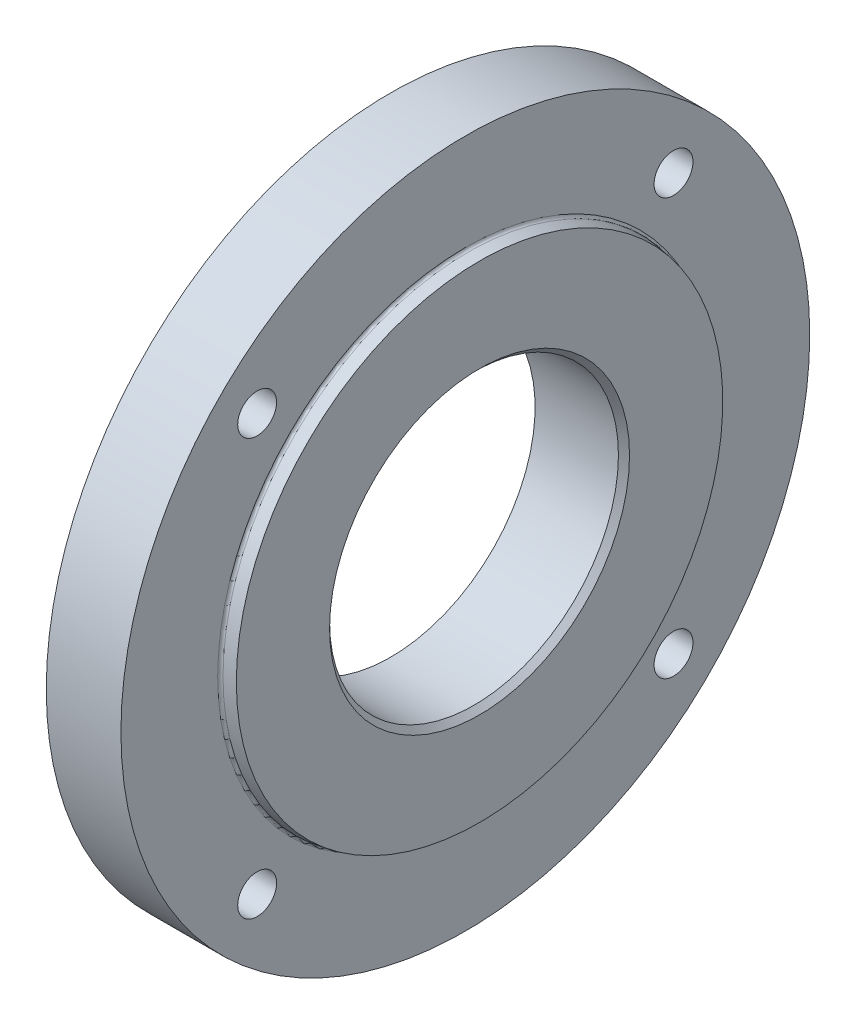
ISO-10303-21;
HEADER;
FILE_DESCRIPTION(('STEP AP214'),'2;1');
FILE_NAME('part.step','',(''),(''),'','','');
FILE_SCHEMA(('AUTOMOTIVE_DESIGN { 1 0 10303 214 1 1 1 1 }'));
ENDSEC;
DATA;
#1=APPLICATION_CONTEXT('core data for automotive mechanical design processes');
#2=APPLICATION_PROTOCOL_DEFINITION('international standard','automotive_design',2000,#1);
#3=PRODUCT_CONTEXT('',#1,'mechanical');
#4=PRODUCT('Part','Part','',(#3));
#5=PRODUCT_RELATED_PRODUCT_CATEGORY('part','',(#4));
#6=PRODUCT_DEFINITION_FORMATION('','',#4);
#7=PRODUCT_DEFINITION_CONTEXT('part definition',#1,'design');
#8=PRODUCT_DEFINITION('design','',#6,#7);
#9=PRODUCT_DEFINITION_SHAPE('','',#8);
#10=(LENGTH_UNIT() NAMED_UNIT(*) SI_UNIT(.MILLI.,.METRE.));
#11=(NAMED_UNIT(*) PLANE_ANGLE_UNIT() SI_UNIT($,.RADIAN.));
#12=(NAMED_UNIT(*) SI_UNIT($,.STERADIAN.) SOLID_ANGLE_UNIT());
#13=UNCERTAINTY_MEASURE_WITH_UNIT(LENGTH_MEASURE(1.E-05),#10,'distance_accuracy_value','');
#14=(GEOMETRIC_REPRESENTATION_CONTEXT(3) GLOBAL_UNCERTAINTY_ASSIGNED_CONTEXT((#13)) GLOBAL_UNIT_ASSIGNED_CONTEXT((#10,
#11,#12)) REPRESENTATION_CONTEXT('',''));
#15=CARTESIAN_POINT('',(0.,0.,0.));
#16=DIRECTION('',(0.,0.,1.));
#17=DIRECTION('',(1.,0.,0.));
#18=AXIS2_PLACEMENT_3D('',#15,#16,#17);
#19=CARTESIAN_POINT('',(0.,0.,0.));
#20=DIRECTION('',(-1.,0.,0.));
#21=DIRECTION('',(0.,0.,1.));
#22=AXIS2_PLACEMENT_3D('',#19,#20,#21);
#23=CYLINDRICAL_SURFACE('',#22,41.275);
#24=CARTESIAN_POINT('',(23.8125000000001,0.,0.));
#25=DIRECTION('',(-1.,0.,0.));
#26=DIRECTION('',(0.,0.,1.));
#27=AXIS2_PLACEMENT_3D('',#24,#25,#26);
#28=CIRCLE('',#27,41.275);
#29=CARTESIAN_POINT('',(23.8125000000001,0.,-41.275));
#30=VERTEX_POINT('',#29);
#31=EDGE_CURVE('E42',#30,#30,#28,.F.);
#32=ORIENTED_EDGE('',*,*,#31,.T.);
#33=EDGE_LOOP('',(#32));
#34=FACE_BOUND('',#33,.T.);
#35=CARTESIAN_POINT('',(0.,0.,0.));
#36=DIRECTION('',(-1.,0.,0.));
#37=DIRECTION('',(0.,0.,1.));
#38=AXIS2_PLACEMENT_3D('',#35,#36,#37);
#39=CIRCLE('',#38,41.275);
#40=CARTESIAN_POINT('',(0.,0.,41.275));
#41=VERTEX_POINT('',#40);
#42=EDGE_CURVE('E58',#41,#41,#39,.T.);
#43=ORIENTED_EDGE('',*,*,#42,.T.);
#44=EDGE_LOOP('',(#43));
#45=FACE_BOUND('',#44,.T.);
#46=ADVANCED_FACE('F35',(#34,#45),#23,.F.);
#47=CARTESIAN_POINT('',(0.,41.275,0.));
#48=DIRECTION('',(1.,0.,0.));
#49=DIRECTION('',(0.,0.,-1.));
#50=AXIS2_PLACEMENT_3D('',#47,#48,#49);
#51=PLANE('',#50);
#52=CARTESIAN_POINT('',(0.,59.4941968020828,59.4941968020835));
#53=DIRECTION('',(1.,0.,0.));
#54=DIRECTION('',(0.,1.,0.));
#55=AXIS2_PLACEMENT_3D('',#52,#53,#54);
#56=CIRCLE('',#55,5.55625000000001);
#57=CARTESIAN_POINT('',(0.,65.0504468020828,59.4941968020835));
#58=VERTEX_POINT('',#57);
#59=EDGE_CURVE('E71',#58,#58,#56,.T.);
#60=ORIENTED_EDGE('',*,*,#59,.T.);
#61=EDGE_LOOP('',(#60));
#62=FACE_BOUND('',#61,.T.);
#63=CARTESIAN_POINT('',(0.,-59.4941968020833,59.494196802083));
#64=DIRECTION('',(1.,0.,0.));
#65=DIRECTION('',(0.,0.,1.));
#66=AXIS2_PLACEMENT_3D('',#63,#64,#65);
#67=CIRCLE('',#66,5.55625000000001);
#68=CARTESIAN_POINT('',(0.,-59.4941968020833,65.050446802083));
#69=VERTEX_POINT('',#68);
#70=EDGE_CURVE('E83',#69,#69,#67,.T.);
#71=ORIENTED_EDGE('',*,*,#70,.T.);
#72=EDGE_LOOP('',(#71));
#73=FACE_BOUND('',#72,.T.);
#74=CARTESIAN_POINT('',(0.,-59.4941968020824,-59.4941968020839));
#75=DIRECTION('',(1.,0.,0.));
#76=DIRECTION('',(0.,-1.,0.));
#77=AXIS2_PLACEMENT_3D('',#74,#75,#76);
#78=CIRCLE('',#77,5.55625000000001);
#79=CARTESIAN_POINT('',(0.,-65.0504468020824,-59.4941968020839));
#80=VERTEX_POINT('',#79);
#81=EDGE_CURVE('E77',#80,#80,#78,.T.);
#82=ORIENTED_EDGE('',*,*,#81,.T.);
#83=EDGE_LOOP('',(#82));
#84=FACE_BOUND('',#83,.T.);
#85=CARTESIAN_POINT('',(0.,59.4941968020833,-59.494196802083));
#86=DIRECTION('',(1.,0.,0.));
#87=DIRECTION('',(0.,0.,-1.));
#88=AXIS2_PLACEMENT_3D('',#85,#86,#87);
#89=CIRCLE('',#88,5.55625000000001);
#90=CARTESIAN_POINT('',(0.,59.4941968020833,-65.050446802083));
#91=VERTEX_POINT('',#90);
#92=EDGE_CURVE('E67',#91,#91,#89,.T.);
#93=ORIENTED_EDGE('',*,*,#92,.T.);
#94=EDGE_LOOP('',(#93));
#95=FACE_BOUND('',#94,.T.);
#96=ORIENTED_EDGE('',*,*,#42,.F.);
#97=EDGE_LOOP('',(#96));
#98=FACE_BOUND('',#97,.T.);
#99=CARTESIAN_POINT('',(0.,0.,0.));
#100=DIRECTION('',(-1.,0.,0.));
#101=DIRECTION('',(0.,0.,1.));
#102=AXIS2_PLACEMENT_3D('',#99,#100,#101);
#103=CIRCLE('',#102,98.425);
#104=CARTESIAN_POINT('',(0.,0.,98.425));
#105=VERTEX_POINT('',#104);
#106=EDGE_CURVE('E61',#105,#105,#103,.T.);
#107=ORIENTED_EDGE('',*,*,#106,.T.);
#108=EDGE_LOOP('',(#107));
#109=FACE_BOUND('',#108,.T.);
#110=ADVANCED_FACE('F92',(#62,#73,#84,#95,#98,#109),#51,.F.);
#111=CARTESIAN_POINT('',(0.,0.,0.));
#112=DIRECTION('',(-1.,0.,0.));
#113=DIRECTION('',(0.,0.,1.));
#114=AXIS2_PLACEMENT_3D('',#111,#112,#113);
#115=CYLINDRICAL_SURFACE('',#114,98.425);
#116=ORIENTED_EDGE('',*,*,#106,.F.);
#117=EDGE_LOOP('',(#116));
#118=FACE_BOUND('',#117,.T.);
#119=CARTESIAN_POINT('',(21.336,0.,0.));
#120=DIRECTION('',(-1.,0.,0.));
#121=DIRECTION('',(0.,0.,1.));
#122=AXIS2_PLACEMENT_3D('',#119,#120,#121);
#123=CIRCLE('',#122,98.425);
#124=CARTESIAN_POINT('',(21.336,0.,98.425));
#125=VERTEX_POINT('',#124);
#126=EDGE_CURVE('E64',#125,#125,#123,.T.);
#127=ORIENTED_EDGE('',*,*,#126,.T.);
#128=EDGE_LOOP('',(#127));
#129=FACE_BOUND('',#128,.T.);
#130=ADVANCED_FACE('F107',(#118,#129),#115,.T.);
#131=CARTESIAN_POINT('',(21.336,98.425,0.));
#132=DIRECTION('',(-1.,0.,0.));
#133=DIRECTION('',(0.,0.,1.));
#134=AXIS2_PLACEMENT_3D('',#131,#132,#133);
#135=PLANE('',#134);
#136=CARTESIAN_POINT('',(21.336,0.,0.));
#137=DIRECTION('',(-1.,0.,0.));
#138=DIRECTION('',(0.,0.,1.));
#139=AXIS2_PLACEMENT_3D('',#136,#137,#138);
#140=CIRCLE('',#139,70.7771);
#141=CARTESIAN_POINT('',(21.336,0.,70.7771));
#142=VERTEX_POINT('',#141);
#143=EDGE_CURVE('E10',#142,#142,#140,.T.);
#144=ORIENTED_EDGE('',*,*,#143,.T.);
#145=EDGE_LOOP('',(#144));
#146=FACE_BOUND('',#145,.T.);
#147=CARTESIAN_POINT('',(21.336,59.4941968020828,59.4941968020835));
#148=DIRECTION('',(1.,0.,0.));
#149=DIRECTION('',(0.,1.,0.));
#150=AXIS2_PLACEMENT_3D('',#147,#148,#149);
#151=CIRCLE('',#150,5.55625000000001);
#152=CARTESIAN_POINT('',(21.336,65.0504468020828,59.4941968020835));
#153=VERTEX_POINT('',#152);
#154=EDGE_CURVE('E86',#153,#153,#151,.T.);
#155=ORIENTED_EDGE('',*,*,#154,.F.);
#156=EDGE_LOOP('',(#155));
#157=FACE_BOUND('',#156,.T.);
#158=CARTESIAN_POINT('',(21.336,-59.4941968020833,59.494196802083));
#159=DIRECTION('',(1.,0.,0.));
#160=DIRECTION('',(0.,0.,1.));
#161=AXIS2_PLACEMENT_3D('',#158,#159,#160);
#162=CIRCLE('',#161,5.55625000000001);
#163=CARTESIAN_POINT('',(21.336,-59.4941968020833,65.050446802083));
#164=VERTEX_POINT('',#163);
#165=EDGE_CURVE('E80',#164,#164,#162,.T.);
#166=ORIENTED_EDGE('',*,*,#165,.F.);
#167=EDGE_LOOP('',(#166));
#168=FACE_BOUND('',#167,.T.);
#169=CARTESIAN_POINT('',(21.336,-59.4941968020824,-59.4941968020839));
#170=DIRECTION('',(1.,0.,0.));
#171=DIRECTION('',(0.,-1.,0.));
#172=AXIS2_PLACEMENT_3D('',#169,#170,#171);
#173=CIRCLE('',#172,5.55625000000001);
#174=CARTESIAN_POINT('',(21.336,-65.0504468020824,-59.4941968020839));
#175=VERTEX_POINT('',#174);
#176=EDGE_CURVE('E74',#175,#175,#173,.T.);
#177=ORIENTED_EDGE('',*,*,#176,.F.);
#178=EDGE_LOOP('',(#177));
#179=FACE_BOUND('',#178,.T.);
#180=CARTESIAN_POINT('',(21.336,59.4941968020833,-59.494196802083));
#181=DIRECTION('',(1.,0.,0.));
#182=DIRECTION('',(0.,0.,-1.));
#183=AXIS2_PLACEMENT_3D('',#180,#181,#182);
#184=CIRCLE('',#183,5.55625000000001);
#185=CARTESIAN_POINT('',(21.336,59.4941968020833,-65.050446802083));
#186=VERTEX_POINT('',#185);
#187=EDGE_CURVE('E68',#186,#186,#184,.T.);
#188=ORIENTED_EDGE('',*,*,#187,.F.);
#189=EDGE_LOOP('',(#188));
#190=FACE_BOUND('',#189,.T.);
#191=ORIENTED_EDGE('',*,*,#126,.F.);
#192=EDGE_LOOP('',(#191));
#193=FACE_BOUND('',#192,.T.);
#194=ADVANCED_FACE('F103',(#146,#157,#168,#179,#190,#193),#135,.F.);
#195=CARTESIAN_POINT('',(25.4,70.0151,0.));
#196=DIRECTION('',(-1.,0.,0.));
#197=DIRECTION('',(0.,0.,1.));
#198=AXIS2_PLACEMENT_3D('',#195,#196,#197);
#199=PLANE('',#198);
#200=CARTESIAN_POINT('',(25.4,0.,0.));
#201=DIRECTION('',(-1.,0.,0.));
#202=DIRECTION('',(0.,0.,1.));
#203=AXIS2_PLACEMENT_3D('',#200,#201,#202);
#204=CIRCLE('',#203,42.8624999999999);
#205=CARTESIAN_POINT('',(25.4,0.,-42.8624999999999));
#206=VERTEX_POINT('',#205);
#207=EDGE_CURVE('E46',#206,#206,#204,.T.);
#208=ORIENTED_EDGE('',*,*,#207,.T.);
#209=EDGE_LOOP('',(#208));
#210=FACE_BOUND('',#209,.T.);
#211=CARTESIAN_POINT('',(25.4,0.,0.));
#212=DIRECTION('',(-1.,0.,0.));
#213=DIRECTION('',(0.,0.,1.));
#214=AXIS2_PLACEMENT_3D('',#211,#212,#213);
#215=CIRCLE('',#214,69.5071000000001);
#216=CARTESIAN_POINT('',(25.4,0.,69.5071000000001));
#217=VERTEX_POINT('',#216);
#218=EDGE_CURVE('E50',#217,#217,#215,.F.);
#219=ORIENTED_EDGE('',*,*,#218,.T.);
#220=EDGE_LOOP('',(#219));
#221=FACE_BOUND('',#220,.T.);
#222=ADVANCED_FACE('F106',(#210,#221),#199,.F.);
#223=CARTESIAN_POINT('',(0.,59.4941968020833,-59.494196802083));
#224=DIRECTION('',(1.,0.,0.));
#225=DIRECTION('',(0.,0.,-1.));
#226=AXIS2_PLACEMENT_3D('',#223,#224,#225);
#227=CYLINDRICAL_SURFACE('',#226,5.55625000000001);
#228=ORIENTED_EDGE('',*,*,#92,.F.);
#229=EDGE_LOOP('',(#228));
#230=FACE_BOUND('',#229,.T.);
#231=ORIENTED_EDGE('',*,*,#187,.T.);
#232=EDGE_LOOP('',(#231));
#233=FACE_BOUND('',#232,.T.);
#234=ADVANCED_FACE('F151',(#230,#233),#227,.F.);
#235=CARTESIAN_POINT('',(0.,-59.4941968020824,-59.4941968020839));
#236=DIRECTION('',(1.,0.,0.));
#237=DIRECTION('',(0.,0.,-1.));
#238=AXIS2_PLACEMENT_3D('',#235,#236,#237);
#239=CYLINDRICAL_SURFACE('',#238,5.55625000000001);
#240=ORIENTED_EDGE('',*,*,#81,.F.);
#241=EDGE_LOOP('',(#240));
#242=FACE_BOUND('',#241,.T.);
#243=ORIENTED_EDGE('',*,*,#176,.T.);
#244=EDGE_LOOP('',(#243));
#245=FACE_BOUND('',#244,.T.);
#246=ADVANCED_FACE('F160',(#242,#245),#239,.F.);
#247=CARTESIAN_POINT('',(0.,-59.4941968020833,59.494196802083));
#248=DIRECTION('',(1.,0.,0.));
#249=DIRECTION('',(0.,0.,-1.));
#250=AXIS2_PLACEMENT_3D('',#247,#248,#249);
#251=CYLINDRICAL_SURFACE('',#250,5.55625000000001);
#252=ORIENTED_EDGE('',*,*,#70,.F.);
#253=EDGE_LOOP('',(#252));
#254=FACE_BOUND('',#253,.T.);
#255=ORIENTED_EDGE('',*,*,#165,.T.);
#256=EDGE_LOOP('',(#255));
#257=FACE_BOUND('',#256,.T.);
#258=ADVANCED_FACE('F99',(#254,#257),#251,.F.);
#259=CARTESIAN_POINT('',(0.,59.4941968020828,59.4941968020835));
#260=DIRECTION('',(1.,0.,0.));
#261=DIRECTION('',(0.,0.,-1.));
#262=AXIS2_PLACEMENT_3D('',#259,#260,#261);
#263=CYLINDRICAL_SURFACE('',#262,5.55625000000001);
#264=ORIENTED_EDGE('',*,*,#59,.F.);
#265=EDGE_LOOP('',(#264));
#266=FACE_BOUND('',#265,.T.);
#267=ORIENTED_EDGE('',*,*,#154,.T.);
#268=EDGE_LOOP('',(#267));
#269=FACE_BOUND('',#268,.T.);
#270=ADVANCED_FACE('F95',(#266,#269),#263,.F.);
#271=CARTESIAN_POINT('',(22.0980000000008,0.,0.));
#272=DIRECTION('',(-1.,0.,0.));
#273=DIRECTION('',(0.,0.,1.));
#274=AXIS2_PLACEMENT_3D('',#271,#272,#273);
#275=CONICAL_SURFACE('',#274,70.0151,0.152649328395263);
#276=ORIENTED_EDGE('',*,*,#218,.F.);
#277=EDGE_LOOP('',(#276));
#278=FACE_BOUND('',#277,.T.);
#279=CARTESIAN_POINT('',(22.0980000000008,0.,0.));
#280=DIRECTION('',(-1.,0.,0.));
#281=DIRECTION('',(0.,0.,1.));
#282=AXIS2_PLACEMENT_3D('',#279,#280,#281);
#283=CIRCLE('',#282,70.0151);
#284=CARTESIAN_POINT('',(22.0980000000008,0.,70.0151));
#285=VERTEX_POINT('',#284);
#286=EDGE_CURVE('E55',#285,#285,#283,.T.);
#287=ORIENTED_EDGE('',*,*,#286,.F.);
#288=EDGE_LOOP('',(#287));
#289=FACE_BOUND('',#288,.T.);
#290=ADVANCED_FACE('F98',(#278,#289),#275,.T.);
#291=CARTESIAN_POINT('',(25.4,0.,0.));
#292=DIRECTION('',(1.,0.,0.));
#293=DIRECTION('',(0.,0.,-1.));
#294=AXIS2_PLACEMENT_3D('',#291,#292,#293);
#295=CONICAL_SURFACE('',#294,42.8624999999999,0.785398163397448);
#296=CARTESIAN_POINT('',(23.8125000000001,0.,-41.275));
#297=CARTESIAN_POINT('',(23.8290364583334,0.,-41.2915364583333));
#298=CARTESIAN_POINT('',(23.8455729166667,0.,-41.3080729166667));
#299=CARTESIAN_POINT('',(23.8786458333334,0.,-41.3411458333333));
#300=CARTESIAN_POINT('',(23.8951822916667,0.,-41.3576822916667));
#301=CARTESIAN_POINT('',(23.9282552083334,0.,-41.3907552083333));
#302=CARTESIAN_POINT('',(23.9447916666667,0.,-41.4072916666667));
#303=CARTESIAN_POINT('',(23.9778645833334,0.,-41.4403645833333));
#304=CARTESIAN_POINT('',(23.9944010416667,0.,-41.4569010416667));
#305=CARTESIAN_POINT('',(24.0274739583334,0.,-41.4899739583333));
#306=CARTESIAN_POINT('',(24.0440104166667,0.,-41.5065104166667));
#307=CARTESIAN_POINT('',(24.0770833333334,0.,-41.5395833333333));
#308=CARTESIAN_POINT('',(24.0936197916667,0.,-41.5561197916667));
#309=CARTESIAN_POINT('',(24.1266927083334,0.,-41.5891927083333));
#310=CARTESIAN_POINT('',(24.1432291666667,0.,-41.6057291666667));
#311=CARTESIAN_POINT('',(24.1763020833334,0.,-41.6388020833333));
#312=CARTESIAN_POINT('',(24.1928385416667,0.,-41.6553385416667));
#313=CARTESIAN_POINT('',(24.2259114583334,0.,-41.6884114583333));
#314=CARTESIAN_POINT('',(24.2424479166667,0.,-41.7049479166667));
#315=CARTESIAN_POINT('',(24.2755208333334,0.,-41.7380208333333));
#316=CARTESIAN_POINT('',(24.2920572916667,0.,-41.7545572916667));
#317=CARTESIAN_POINT('',(24.3251302083334,0.,-41.7876302083333));
#318=CARTESIAN_POINT('',(24.3416666666667,0.,-41.8041666666666));
#319=CARTESIAN_POINT('',(24.3747395833334,0.,-41.8372395833333));
#320=CARTESIAN_POINT('',(24.3912760416667,0.,-41.8537760416666));
#321=CARTESIAN_POINT('',(24.4243489583334,0.,-41.8868489583333));
#322=CARTESIAN_POINT('',(24.4408854166667,0.,-41.9033854166666));
#323=CARTESIAN_POINT('',(24.4739583333334,0.,-41.9364583333333));
#324=CARTESIAN_POINT('',(24.4904947916667,0.,-41.9529947916666));
#325=CARTESIAN_POINT('',(24.5235677083334,0.,-41.9860677083333));
#326=CARTESIAN_POINT('',(24.5401041666667,0.,-42.0026041666666));
#327=CARTESIAN_POINT('',(24.5731770833334,0.,-42.0356770833333));
#328=CARTESIAN_POINT('',(24.5897135416667,0.,-42.0522135416666));
#329=CARTESIAN_POINT('',(24.6227864583334,0.,-42.0852864583333));
#330=CARTESIAN_POINT('',(24.6393229166667,0.,-42.1018229166666));
#331=CARTESIAN_POINT('',(24.6723958333334,0.,-42.1348958333333));
#332=CARTESIAN_POINT('',(24.6889322916667,0.,-42.1514322916666));
#333=CARTESIAN_POINT('',(24.7220052083334,0.,-42.1845052083333));
#334=CARTESIAN_POINT('',(24.7385416666667,0.,-42.2010416666666));
#335=CARTESIAN_POINT('',(24.7716145833334,0.,-42.2341145833333));
#336=CARTESIAN_POINT('',(24.7881510416667,0.,-42.2506510416666));
#337=CARTESIAN_POINT('',(24.8212239583334,0.,-42.2837239583333));
#338=CARTESIAN_POINT('',(24.8377604166667,0.,-42.3002604166666));
#339=CARTESIAN_POINT('',(24.8708333333334,0.,-42.3333333333333));
#340=CARTESIAN_POINT('',(24.8873697916667,0.,-42.3498697916666));
#341=CARTESIAN_POINT('',(24.9204427083334,0.,-42.3829427083333));
#342=CARTESIAN_POINT('',(24.9369791666667,0.,-42.3994791666666));
#343=CARTESIAN_POINT('',(24.9700520833333,0.,-42.4325520833333));
#344=CARTESIAN_POINT('',(24.9865885416667,0.,-42.4490885416666));
#345=CARTESIAN_POINT('',(25.0196614583333,0.,-42.4821614583333));
#346=CARTESIAN_POINT('',(25.0361979166667,0.,-42.4986979166666));
#347=CARTESIAN_POINT('',(25.0692708333333,0.,-42.5317708333333));
#348=CARTESIAN_POINT('',(25.0858072916667,0.,-42.5483072916666));
#349=CARTESIAN_POINT('',(25.1188802083333,0.,-42.5813802083333));
#350=CARTESIAN_POINT('',(25.1354166666667,0.,-42.5979166666666));
#351=CARTESIAN_POINT('',(25.1684895833333,0.,-42.6309895833333));
#352=CARTESIAN_POINT('',(25.1850260416667,0.,-42.6475260416666));
#353=CARTESIAN_POINT('',(25.2180989583333,0.,-42.6805989583333));
#354=CARTESIAN_POINT('',(25.2346354166667,0.,-42.6971354166666));
#355=CARTESIAN_POINT('',(25.2677083333333,0.,-42.7302083333333));
#356=CARTESIAN_POINT('',(25.2842447916667,0.,-42.7467447916666));
#357=CARTESIAN_POINT('',(25.3173177083333,0.,-42.7798177083333));
#358=CARTESIAN_POINT('',(25.3338541666667,0.,-42.7963541666666));
#359=CARTESIAN_POINT('',(25.3669270833333,0.,-42.8294270833333));
#360=CARTESIAN_POINT('',(25.3834635416667,0.,-42.8459635416666));
#361=CARTESIAN_POINT('',(25.4,0.,-42.8624999999999));
#362=B_SPLINE_CURVE_WITH_KNOTS('',3,(#296,#297,#298,#299,#300,#301,#302,#303,#304,#305,#306,
#307,#308,#309,#310,#311,#312,#313,#314,#315,#316,#317,#318,#319,#320,#321,#322,#323,#324,#325,
#326,#327,#328,#329,#330,#331,#332,#333,#334,#335,#336,#337,#338,#339,#340,#341,#342,#343,#344,
#345,#346,#347,#348,#349,#350,#351,#352,#353,#354,#355,#356,#357,#358,#359,#360,#361),
.UNSPECIFIED.,.F.,.F.,(4,2,2,2,2,2,2,2,2,2,2,2,2,2,2,2,2,2,2,2,2,2,2,2,2,2,2,2,2,2,2,2,4),(0.,
0.0701582509458512,0.1403165018917,0.210474752837549,0.280633003783402,0.350791254729251,
0.420949505675102,0.491107756620951,0.561266007566799,0.631424258512653,0.701582509458502,
0.771740760404355,0.841899011350202,0.912057262296055,0.982215513241904,1.05237376418775,
1.12253201513361,1.19269026607945,1.26284851702531,1.33300676797115,1.403165018917,
1.47332326986286,1.5434815208087,1.61363977175456,1.68379802270041,1.75395627364625,
1.82411452459211,1.89427277553795,1.96443102648381,2.03458927742966,2.10474752837551,
2.17490577932136,2.24506403026721),.UNSPECIFIED.);
#363=EDGE_CURVE('BSEAM136',#30,#206,#362,.T.);
#364=ORIENTED_EDGE('',*,*,#31,.F.);
#365=ORIENTED_EDGE('',*,*,#207,.F.);
#366=ORIENTED_EDGE('',*,*,#363,.T.);
#367=ORIENTED_EDGE('',*,*,#363,.F.);
#368=EDGE_LOOP('',(#364,#366,#365,#367));
#369=FACE_BOUND('',#368,.T.);
#370=ADVANCED_FACE('F136',(#369),#295,.F.);
#371=CARTESIAN_POINT('',(22.098,0.,0.));
#372=DIRECTION('',(-1.,0.,0.));
#373=DIRECTION('',(0.,0.,1.));
#374=AXIS2_PLACEMENT_3D('',#371,#372,#373);
#375=TOROIDAL_SURFACE('',#374,70.7771,0.762);
#376=ORIENTED_EDGE('',*,*,#286,.T.);
#377=EDGE_LOOP('',(#376));
#378=FACE_BOUND('',#377,.T.);
#379=ORIENTED_EDGE('',*,*,#143,.F.);
#380=EDGE_LOOP('',(#379));
#381=FACE_BOUND('',#380,.T.);
#382=ADVANCED_FACE('F37',(#378,#381),#375,.F.);
#383=CLOSED_SHELL('',(#46,#110,#130,#194,#222,#234,#246,#258,#270,#290,#370,#382));
#384=MANIFOLD_SOLID_BREP('B2',#383);
#385=ADVANCED_BREP_SHAPE_REPRESENTATION('',(#18,#384),#14);
#386=SHAPE_DEFINITION_REPRESENTATION(#9,#385);
ENDSEC;
END-ISO-10303-21;
